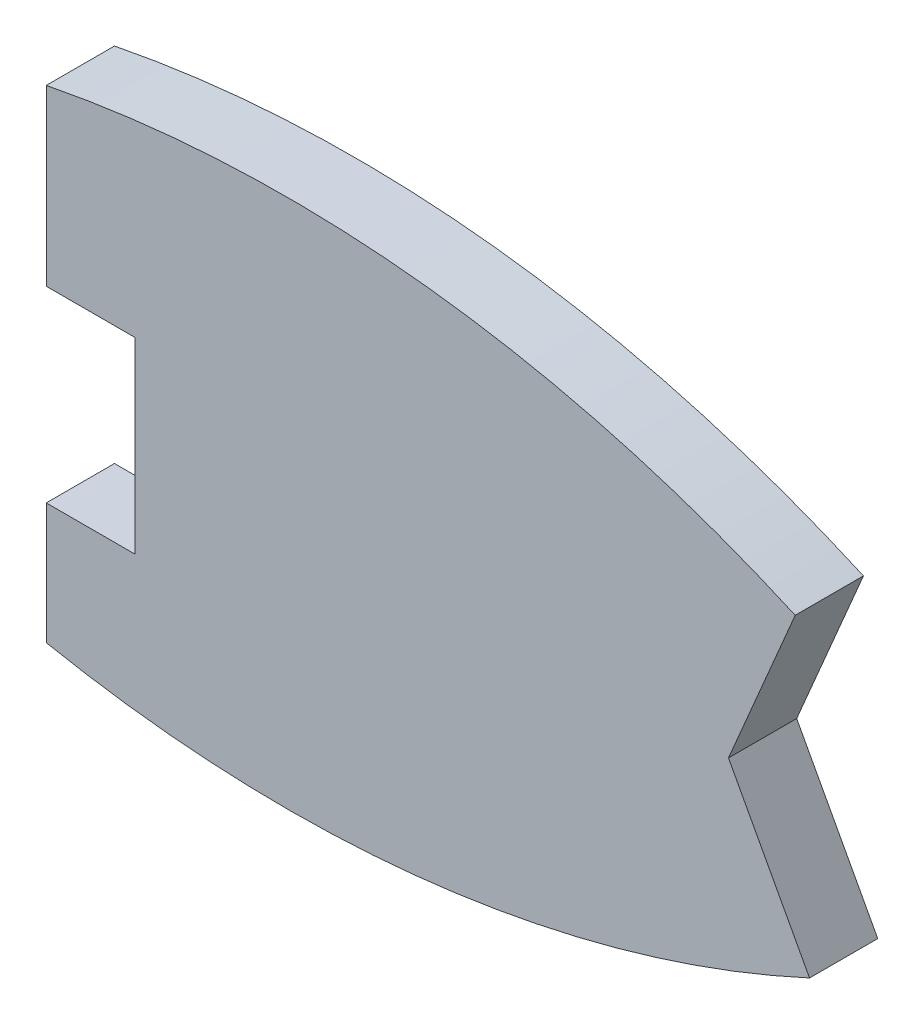
ISO-10303-21;
HEADER;
FILE_DESCRIPTION(('STEP AP214'),'2;1');
FILE_NAME('part.step','',(''),(''),'','','');
FILE_SCHEMA(('AUTOMOTIVE_DESIGN { 1 0 10303 214 1 1 1 1 }'));
ENDSEC;
DATA;
#1=APPLICATION_CONTEXT('core data for automotive mechanical design processes');
#2=APPLICATION_PROTOCOL_DEFINITION('international standard','automotive_design',2000,#1);
#3=PRODUCT_CONTEXT('',#1,'mechanical');
#4=PRODUCT('Part','Part','',(#3));
#5=PRODUCT_RELATED_PRODUCT_CATEGORY('part','',(#4));
#6=PRODUCT_DEFINITION_FORMATION('','',#4);
#7=PRODUCT_DEFINITION_CONTEXT('part definition',#1,'design');
#8=PRODUCT_DEFINITION('design','',#6,#7);
#9=PRODUCT_DEFINITION_SHAPE('','',#8);
#10=(LENGTH_UNIT() NAMED_UNIT(*) SI_UNIT(.MILLI.,.METRE.));
#11=(NAMED_UNIT(*) PLANE_ANGLE_UNIT() SI_UNIT($,.RADIAN.));
#12=(NAMED_UNIT(*) SI_UNIT($,.STERADIAN.) SOLID_ANGLE_UNIT());
#13=UNCERTAINTY_MEASURE_WITH_UNIT(LENGTH_MEASURE(1.E-05),#10,'distance_accuracy_value','');
#14=(GEOMETRIC_REPRESENTATION_CONTEXT(3) GLOBAL_UNCERTAINTY_ASSIGNED_CONTEXT((#13)) GLOBAL_UNIT_ASSIGNED_CONTEXT((#10,
#11,#12)) REPRESENTATION_CONTEXT('',''));
#15=CARTESIAN_POINT('',(0.,0.,0.));
#16=DIRECTION('',(0.,0.,1.));
#17=DIRECTION('',(1.,0.,0.));
#18=AXIS2_PLACEMENT_3D('',#15,#16,#17);
#19=CARTESIAN_POINT('',(-5.2,-12.6,4.));
#20=DIRECTION('',(-1.,0.,0.));
#21=DIRECTION('',(0.,0.,1.));
#22=AXIS2_PLACEMENT_3D('',#19,#20,#21);
#23=PLANE('',#22);
#24=DIRECTION('',(0.,1.,0.));
#25=VECTOR('',#24,1.);
#26=CARTESIAN_POINT('',(-5.2,-12.6,0.));
#27=LINE('',#26,#25);
#28=CARTESIAN_POINT('',(-5.19999999999999,-12.6,0.));
#29=VERTEX_POINT('',#28);
#30=CARTESIAN_POINT('',(-5.2,-5.5,0.));
#31=VERTEX_POINT('',#30);
#32=EDGE_CURVE('E140',#29,#31,#27,.T.);
#33=ORIENTED_EDGE('',*,*,#32,.F.);
#34=DIRECTION('',(0.,0.,-1.));
#35=VECTOR('',#34,1.);
#36=CARTESIAN_POINT('',(-5.19999999999999,-12.6,4.));
#37=LINE('',#36,#35);
#38=CARTESIAN_POINT('',(-5.19999999999999,-12.6,4.));
#39=VERTEX_POINT('',#38);
#40=EDGE_CURVE('E11',#39,#29,#37,.T.);
#41=ORIENTED_EDGE('',*,*,#40,.F.);
#42=DIRECTION('',(0.,1.,0.));
#43=VECTOR('',#42,1.);
#44=CARTESIAN_POINT('',(-5.2,-12.6,4.));
#45=LINE('',#44,#43);
#46=CARTESIAN_POINT('',(-5.2,-5.5,4.));
#47=VERTEX_POINT('',#46);
#48=EDGE_CURVE('E162',#39,#47,#45,.T.);
#49=ORIENTED_EDGE('',*,*,#48,.T.);
#50=DIRECTION('',(0.,0.,-1.));
#51=VECTOR('',#50,1.);
#52=CARTESIAN_POINT('',(-5.2,-5.5,4.));
#53=LINE('',#52,#51);
#54=EDGE_CURVE('E39',#47,#31,#53,.T.);
#55=ORIENTED_EDGE('',*,*,#54,.T.);
#56=EDGE_LOOP('',(#33,#41,#49,#55));
#57=FACE_BOUND('',#56,.T.);
#58=ADVANCED_FACE('F36',(#57),#23,.T.);
#59=CARTESIAN_POINT('',(8.93194658974413,59.019048343193,4.));
#60=DIRECTION('',(0.,0.,-1.));
#61=DIRECTION('',(-1.,0.,0.));
#62=AXIS2_PLACEMENT_3D('',#59,#60,#61);
#63=CYLINDRICAL_SURFACE('',#62,73.);
#64=CARTESIAN_POINT('',(8.93194658974413,59.019048343193,0.));
#65=DIRECTION('',(0.,0.,1.));
#66=DIRECTION('',(1.,0.,0.));
#67=AXIS2_PLACEMENT_3D('',#64,#65,#66);
#68=CIRCLE('',#67,73.);
#69=CARTESIAN_POINT('',(39.5532070372255,-7.24812609941854,0.));
#70=VERTEX_POINT('',#69);
#71=EDGE_CURVE('E161',#29,#70,#68,.T.);
#72=ORIENTED_EDGE('',*,*,#71,.T.);
#73=DIRECTION('',(0.,0.,-1.));
#74=VECTOR('',#73,1.);
#75=CARTESIAN_POINT('',(39.5532070372255,-7.24812609941854,4.));
#76=LINE('',#75,#74);
#77=CARTESIAN_POINT('',(39.5532070372255,-7.24812609941854,4.));
#78=VERTEX_POINT('',#77);
#79=EDGE_CURVE('E45',#78,#70,#76,.T.);
#80=ORIENTED_EDGE('',*,*,#79,.F.);
#81=CARTESIAN_POINT('',(8.93194658974413,59.019048343193,4.));
#82=DIRECTION('',(0.,0.,1.));
#83=DIRECTION('',(1.,0.,0.));
#84=AXIS2_PLACEMENT_3D('',#81,#82,#83);
#85=CIRCLE('',#84,73.);
#86=EDGE_CURVE('E130',#39,#78,#85,.T.);
#87=ORIENTED_EDGE('',*,*,#86,.F.);
#88=ORIENTED_EDGE('',*,*,#40,.T.);
#89=EDGE_LOOP('',(#72,#80,#87,#88));
#90=FACE_BOUND('',#89,.T.);
#91=ADVANCED_FACE('F176',(#90),#63,.T.);
#92=CARTESIAN_POINT('',(34.8,1.55,4.));
#93=DIRECTION('',(0.879812609941854,0.475320703722552,0.));
#94=DIRECTION('',(-0.475320703722552,0.879812609941854,0.));
#95=AXIS2_PLACEMENT_3D('',#92,#93,#94);
#96=PLANE('',#95);
#97=DIRECTION('',(0.475320703722552,-0.879812609941854,0.));
#98=VECTOR('',#97,1.);
#99=CARTESIAN_POINT('',(34.8,1.55,0.));
#100=LINE('',#99,#98);
#101=CARTESIAN_POINT('',(34.8,1.55,0.));
#102=VERTEX_POINT('',#101);
#103=EDGE_CURVE('E116',#102,#70,#100,.T.);
#104=ORIENTED_EDGE('',*,*,#103,.F.);
#105=DIRECTION('',(0.,0.,-1.));
#106=VECTOR('',#105,1.);
#107=CARTESIAN_POINT('',(34.8,1.55,4.));
#108=LINE('',#107,#106);
#109=CARTESIAN_POINT('',(34.8,1.55,4.));
#110=VERTEX_POINT('',#109);
#111=EDGE_CURVE('E111',#110,#102,#108,.T.);
#112=ORIENTED_EDGE('',*,*,#111,.F.);
#113=DIRECTION('',(0.475320703722552,-0.879812609941854,0.));
#114=VECTOR('',#113,1.);
#115=CARTESIAN_POINT('',(34.8,1.55,4.));
#116=LINE('',#115,#114);
#117=EDGE_CURVE('E114',#110,#78,#116,.T.);
#118=ORIENTED_EDGE('',*,*,#117,.T.);
#119=ORIENTED_EDGE('',*,*,#79,.T.);
#120=EDGE_LOOP('',(#104,#112,#118,#119));
#121=FACE_BOUND('',#120,.T.);
#122=ADVANCED_FACE('F113',(#121),#96,.T.);
#123=CARTESIAN_POINT('',(38.7147818225027,10.7518739005815,4.));
#124=DIRECTION('',(0.920187390058145,-0.391478182250274,0.));
#125=DIRECTION('',(0.391478182250274,0.920187390058145,0.));
#126=AXIS2_PLACEMENT_3D('',#123,#124,#125);
#127=PLANE('',#126);
#128=DIRECTION('',(-0.391478182250274,-0.920187390058145,0.));
#129=VECTOR('',#128,1.);
#130=CARTESIAN_POINT('',(38.7147818225027,10.7518739005815,0.));
#131=LINE('',#130,#129);
#132=CARTESIAN_POINT('',(38.7147818225027,10.7518739005815,0.));
#133=VERTEX_POINT('',#132);
#134=EDGE_CURVE('E158',#133,#102,#131,.T.);
#135=ORIENTED_EDGE('',*,*,#134,.F.);
#136=DIRECTION('',(0.,0.,-1.));
#137=VECTOR('',#136,1.);
#138=CARTESIAN_POINT('',(38.7147818225027,10.7518739005815,4.));
#139=LINE('',#138,#137);
#140=CARTESIAN_POINT('',(38.7147818225027,10.7518739005815,4.));
#141=VERTEX_POINT('',#140);
#142=EDGE_CURVE('E121',#141,#133,#139,.T.);
#143=ORIENTED_EDGE('',*,*,#142,.F.);
#144=DIRECTION('',(-0.391478182250274,-0.920187390058145,0.));
#145=VECTOR('',#144,1.);
#146=CARTESIAN_POINT('',(38.7147818225027,10.7518739005815,4.));
#147=LINE('',#146,#145);
#148=EDGE_CURVE('E128',#141,#110,#147,.T.);
#149=ORIENTED_EDGE('',*,*,#148,.T.);
#150=ORIENTED_EDGE('',*,*,#111,.T.);
#151=EDGE_LOOP('',(#135,#143,#149,#150));
#152=FACE_BOUND('',#151,.T.);
#153=ADVANCED_FACE('F132',(#152),#127,.T.);
#154=CARTESIAN_POINT('',(8.96722079405653,-55.9120789739584,4.));
#155=DIRECTION('',(0.,0.,-1.));
#156=DIRECTION('',(-1.,0.,0.));
#157=AXIS2_PLACEMENT_3D('',#154,#155,#156);
#158=CYLINDRICAL_SURFACE('',#157,73.);
#159=CARTESIAN_POINT('',(8.96722079405653,-55.9120789739584,0.));
#160=DIRECTION('',(0.,0.,-1.));
#161=DIRECTION('',(-1.,0.,0.));
#162=AXIS2_PLACEMENT_3D('',#159,#160,#161);
#163=CIRCLE('',#162,73.);
#164=CARTESIAN_POINT('',(-5.2,15.7,0.));
#165=VERTEX_POINT('',#164);
#166=EDGE_CURVE('E155',#165,#133,#163,.T.);
#167=ORIENTED_EDGE('',*,*,#166,.F.);
#168=DIRECTION('',(0.,0.,-1.));
#169=VECTOR('',#168,1.);
#170=CARTESIAN_POINT('',(-5.2,15.7,4.));
#171=LINE('',#170,#169);
#172=CARTESIAN_POINT('',(-5.2,15.7,4.));
#173=VERTEX_POINT('',#172);
#174=EDGE_CURVE('E166',#173,#165,#171,.T.);
#175=ORIENTED_EDGE('',*,*,#174,.F.);
#176=CARTESIAN_POINT('',(8.96722079405653,-55.9120789739584,4.));
#177=DIRECTION('',(0.,0.,-1.));
#178=DIRECTION('',(-1.,0.,0.));
#179=AXIS2_PLACEMENT_3D('',#176,#177,#178);
#180=CIRCLE('',#179,73.);
#181=EDGE_CURVE('E133',#173,#141,#180,.T.);
#182=ORIENTED_EDGE('',*,*,#181,.T.);
#183=ORIENTED_EDGE('',*,*,#142,.T.);
#184=EDGE_LOOP('',(#167,#175,#182,#183));
#185=FACE_BOUND('',#184,.T.);
#186=ADVANCED_FACE('F200',(#185),#158,.T.);
#187=CARTESIAN_POINT('',(-5.2,5.5,4.));
#188=DIRECTION('',(-1.,0.,0.));
#189=DIRECTION('',(0.,-1.,0.));
#190=AXIS2_PLACEMENT_3D('',#187,#188,#189);
#191=PLANE('',#190);
#192=DIRECTION('',(0.,1.,0.));
#193=VECTOR('',#192,1.);
#194=CARTESIAN_POINT('',(-5.2,5.5,0.));
#195=LINE('',#194,#193);
#196=CARTESIAN_POINT('',(-5.2,5.5,0.));
#197=VERTEX_POINT('',#196);
#198=EDGE_CURVE('E152',#197,#165,#195,.T.);
#199=ORIENTED_EDGE('',*,*,#198,.F.);
#200=DIRECTION('',(0.,0.,-1.));
#201=VECTOR('',#200,1.);
#202=CARTESIAN_POINT('',(-5.2,5.5,4.));
#203=LINE('',#202,#201);
#204=CARTESIAN_POINT('',(-5.2,5.5,4.));
#205=VERTEX_POINT('',#204);
#206=EDGE_CURVE('E168',#205,#197,#203,.T.);
#207=ORIENTED_EDGE('',*,*,#206,.F.);
#208=DIRECTION('',(0.,1.,0.));
#209=VECTOR('',#208,1.);
#210=CARTESIAN_POINT('',(-5.2,5.5,4.));
#211=LINE('',#210,#209);
#212=EDGE_CURVE('E135',#205,#173,#211,.T.);
#213=ORIENTED_EDGE('',*,*,#212,.T.);
#214=ORIENTED_EDGE('',*,*,#174,.T.);
#215=EDGE_LOOP('',(#199,#207,#213,#214));
#216=FACE_BOUND('',#215,.T.);
#217=ADVANCED_FACE('F191',(#216),#191,.T.);
#218=CARTESIAN_POINT('',(0.,5.5,4.));
#219=DIRECTION('',(0.,-1.,0.));
#220=DIRECTION('',(1.,0.,0.));
#221=AXIS2_PLACEMENT_3D('',#218,#219,#220);
#222=PLANE('',#221);
#223=DIRECTION('',(-1.,0.,0.));
#224=VECTOR('',#223,1.);
#225=CARTESIAN_POINT('',(0.,5.5,0.));
#226=LINE('',#225,#224);
#227=CARTESIAN_POINT('',(0.,5.5,0.));
#228=VERTEX_POINT('',#227);
#229=EDGE_CURVE('E149',#228,#197,#226,.T.);
#230=ORIENTED_EDGE('',*,*,#229,.F.);
#231=DIRECTION('',(0.,0.,-1.));
#232=VECTOR('',#231,1.);
#233=CARTESIAN_POINT('',(0.,5.5,4.));
#234=LINE('',#233,#232);
#235=CARTESIAN_POINT('',(0.,5.5,4.));
#236=VERTEX_POINT('',#235);
#237=EDGE_CURVE('E170',#236,#228,#234,.T.);
#238=ORIENTED_EDGE('',*,*,#237,.F.);
#239=DIRECTION('',(-1.,0.,0.));
#240=VECTOR('',#239,1.);
#241=CARTESIAN_POINT('',(0.,5.5,4.));
#242=LINE('',#241,#240);
#243=EDGE_CURVE('E185',#236,#205,#242,.T.);
#244=ORIENTED_EDGE('',*,*,#243,.T.);
#245=ORIENTED_EDGE('',*,*,#206,.T.);
#246=EDGE_LOOP('',(#230,#238,#244,#245));
#247=FACE_BOUND('',#246,.T.);
#248=ADVANCED_FACE('F196',(#247),#222,.T.);
#249=CARTESIAN_POINT('',(0.,-5.5,4.));
#250=DIRECTION('',(-1.,0.,0.));
#251=DIRECTION('',(0.,-1.,0.));
#252=AXIS2_PLACEMENT_3D('',#249,#250,#251);
#253=PLANE('',#252);
#254=DIRECTION('',(0.,1.,0.));
#255=VECTOR('',#254,1.);
#256=CARTESIAN_POINT('',(0.,-5.5,0.));
#257=LINE('',#256,#255);
#258=CARTESIAN_POINT('',(0.,-5.5,0.));
#259=VERTEX_POINT('',#258);
#260=EDGE_CURVE('E146',#259,#228,#257,.T.);
#261=ORIENTED_EDGE('',*,*,#260,.F.);
#262=DIRECTION('',(0.,0.,-1.));
#263=VECTOR('',#262,1.);
#264=CARTESIAN_POINT('',(0.,-5.5,4.));
#265=LINE('',#264,#263);
#266=CARTESIAN_POINT('',(0.,-5.5,4.));
#267=VERTEX_POINT('',#266);
#268=EDGE_CURVE('E171',#267,#259,#265,.T.);
#269=ORIENTED_EDGE('',*,*,#268,.F.);
#270=DIRECTION('',(0.,1.,0.));
#271=VECTOR('',#270,1.);
#272=CARTESIAN_POINT('',(0.,-5.5,4.));
#273=LINE('',#272,#271);
#274=EDGE_CURVE('E180',#267,#236,#273,.T.);
#275=ORIENTED_EDGE('',*,*,#274,.T.);
#276=ORIENTED_EDGE('',*,*,#237,.T.);
#277=EDGE_LOOP('',(#261,#269,#275,#276));
#278=FACE_BOUND('',#277,.T.);
#279=ADVANCED_FACE('F198',(#278),#253,.T.);
#280=CARTESIAN_POINT('',(-5.2,-5.5,4.));
#281=DIRECTION('',(0.,1.,0.));
#282=DIRECTION('',(0.,0.,1.));
#283=AXIS2_PLACEMENT_3D('',#280,#281,#282);
#284=PLANE('',#283);
#285=DIRECTION('',(1.,0.,0.));
#286=VECTOR('',#285,1.);
#287=CARTESIAN_POINT('',(-5.2,-5.5,0.));
#288=LINE('',#287,#286);
#289=EDGE_CURVE('E143',#31,#259,#288,.T.);
#290=ORIENTED_EDGE('',*,*,#289,.F.);
#291=ORIENTED_EDGE('',*,*,#54,.F.);
#292=DIRECTION('',(1.,0.,0.));
#293=VECTOR('',#292,1.);
#294=CARTESIAN_POINT('',(-5.2,-5.5,4.));
#295=LINE('',#294,#293);
#296=EDGE_CURVE('E178',#47,#267,#295,.T.);
#297=ORIENTED_EDGE('',*,*,#296,.T.);
#298=ORIENTED_EDGE('',*,*,#268,.T.);
#299=EDGE_LOOP('',(#290,#291,#297,#298));
#300=FACE_BOUND('',#299,.T.);
#301=ADVANCED_FACE('F173',(#300),#284,.T.);
#302=CARTESIAN_POINT('',(8.96722079405653,-55.9120789739584,4.));
#303=DIRECTION('',(0.,0.,-1.));
#304=DIRECTION('',(-1.,0.,0.));
#305=AXIS2_PLACEMENT_3D('',#302,#303,#304);
#306=PLANE('',#305);
#307=ORIENTED_EDGE('',*,*,#48,.F.);
#308=ORIENTED_EDGE('',*,*,#86,.T.);
#309=ORIENTED_EDGE('',*,*,#117,.F.);
#310=ORIENTED_EDGE('',*,*,#148,.F.);
#311=ORIENTED_EDGE('',*,*,#181,.F.);
#312=ORIENTED_EDGE('',*,*,#212,.F.);
#313=ORIENTED_EDGE('',*,*,#243,.F.);
#314=ORIENTED_EDGE('',*,*,#274,.F.);
#315=ORIENTED_EDGE('',*,*,#296,.F.);
#316=EDGE_LOOP('',(#307,#308,#309,#310,#311,#312,#313,#314,#315));
#317=FACE_BOUND('',#316,.T.);
#318=ADVANCED_FACE('F126',(#317),#306,.F.);
#319=CARTESIAN_POINT('',(8.96722079405653,-55.9120789739584,0.));
#320=DIRECTION('',(0.,0.,-1.));
#321=DIRECTION('',(-1.,0.,0.));
#322=AXIS2_PLACEMENT_3D('',#319,#320,#321);
#323=PLANE('',#322);
#324=ORIENTED_EDGE('',*,*,#32,.T.);
#325=ORIENTED_EDGE('',*,*,#289,.T.);
#326=ORIENTED_EDGE('',*,*,#260,.T.);
#327=ORIENTED_EDGE('',*,*,#229,.T.);
#328=ORIENTED_EDGE('',*,*,#198,.T.);
#329=ORIENTED_EDGE('',*,*,#166,.T.);
#330=ORIENTED_EDGE('',*,*,#134,.T.);
#331=ORIENTED_EDGE('',*,*,#103,.T.);
#332=ORIENTED_EDGE('',*,*,#71,.F.);
#333=EDGE_LOOP('',(#324,#325,#326,#327,#328,#329,#330,#331,#332));
#334=FACE_BOUND('',#333,.T.);
#335=ADVANCED_FACE('F175',(#334),#323,.T.);
#336=CLOSED_SHELL('',(#58,#91,#122,#153,#186,#217,#248,#279,#301,#318,#335));
#337=MANIFOLD_SOLID_BREP('B2',#336);
#338=ADVANCED_BREP_SHAPE_REPRESENTATION('',(#18,#337),#14);
#339=SHAPE_DEFINITION_REPRESENTATION(#9,#338);
ENDSEC;
END-ISO-10303-21;
